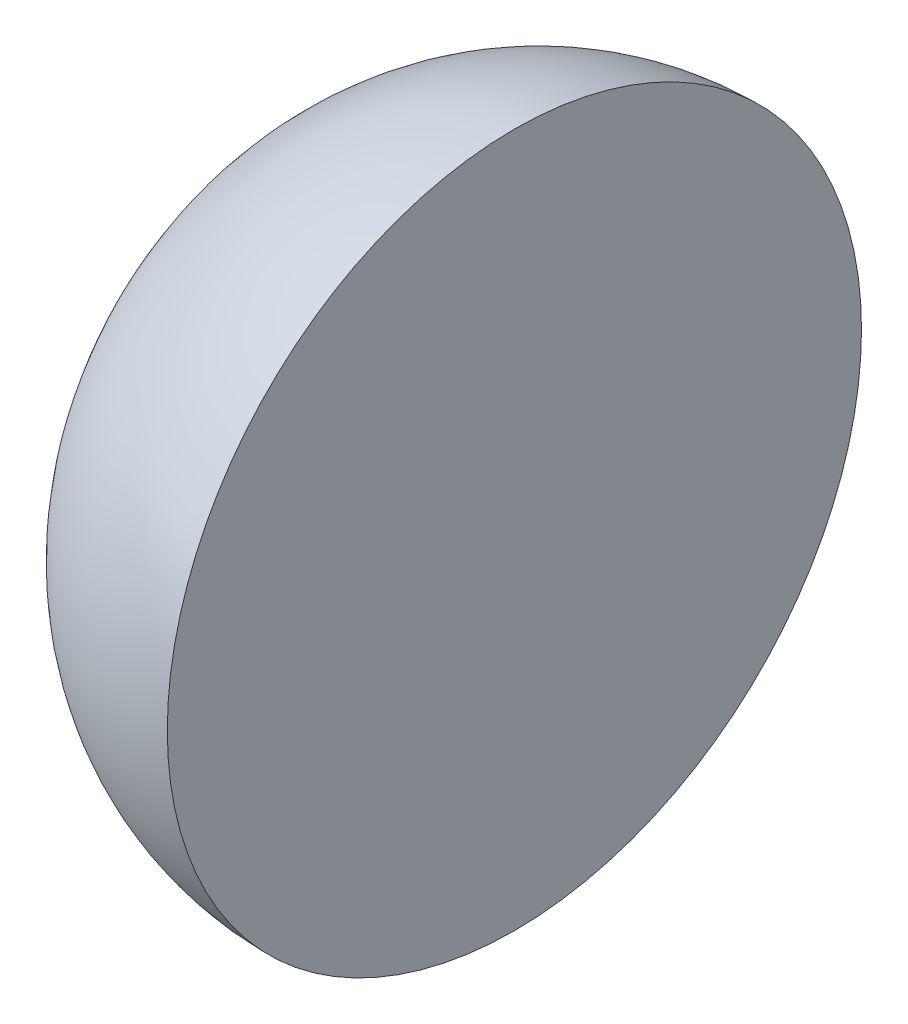
ISO-10303-21;
HEADER;
FILE_DESCRIPTION(('STEP AP214'),'2;1');
FILE_NAME('part.step','',(''),(''),'','','');
FILE_SCHEMA(('AUTOMOTIVE_DESIGN { 1 0 10303 214 1 1 1 1 }'));
ENDSEC;
DATA;
#1=APPLICATION_CONTEXT('core data for automotive mechanical design processes');
#2=APPLICATION_PROTOCOL_DEFINITION('international standard','automotive_design',2000,#1);
#3=PRODUCT_CONTEXT('',#1,'mechanical');
#4=PRODUCT('Part','Part','',(#3));
#5=PRODUCT_RELATED_PRODUCT_CATEGORY('part','',(#4));
#6=PRODUCT_DEFINITION_FORMATION('','',#4);
#7=PRODUCT_DEFINITION_CONTEXT('part definition',#1,'design');
#8=PRODUCT_DEFINITION('design','',#6,#7);
#9=PRODUCT_DEFINITION_SHAPE('','',#8);
#10=(LENGTH_UNIT() NAMED_UNIT(*) SI_UNIT(.MILLI.,.METRE.));
#11=(NAMED_UNIT(*) PLANE_ANGLE_UNIT() SI_UNIT($,.RADIAN.));
#12=(NAMED_UNIT(*) SI_UNIT($,.STERADIAN.) SOLID_ANGLE_UNIT());
#13=UNCERTAINTY_MEASURE_WITH_UNIT(LENGTH_MEASURE(1.E-05),#10,'distance_accuracy_value','');
#14=(GEOMETRIC_REPRESENTATION_CONTEXT(3) GLOBAL_UNCERTAINTY_ASSIGNED_CONTEXT((#13)) GLOBAL_UNIT_ASSIGNED_CONTEXT((#10,
#11,#12)) REPRESENTATION_CONTEXT('',''));
#15=CARTESIAN_POINT('',(0.,0.,0.));
#16=DIRECTION('',(0.,0.,1.));
#17=DIRECTION('',(1.,0.,0.));
#18=AXIS2_PLACEMENT_3D('',#15,#16,#17);
#19=CARTESIAN_POINT('',(-20.75,9.75,2.75));
#20=DIRECTION('',(1.,0.,0.));
#21=DIRECTION('',(0.,0.,-1.));
#22=AXIS2_PLACEMENT_3D('',#19,#20,#21);
#23=PLANE('',#22);
#24=DIRECTION('',(0.,1.,0.));
#25=VECTOR('',#24,1.);
#26=CARTESIAN_POINT('',(-20.75,10.125,2.375));
#27=LINE('',#26,#25);
#28=CARTESIAN_POINT('',(-20.75,11.125,2.375));
#29=VERTEX_POINT('',#28);
#30=CARTESIAN_POINT('',(-20.75,10.125,2.375));
#31=VERTEX_POINT('',#30);
#32=EDGE_CURVE('E122',#29,#31,#27,.F.);
#33=ORIENTED_EDGE('',*,*,#32,.T.);
#34=DIRECTION('',(0.,0.,1.));
#35=VECTOR('',#34,1.);
#36=CARTESIAN_POINT('',(-20.75,10.125,1.375));
#37=LINE('',#36,#35);
#38=CARTESIAN_POINT('',(-20.75,10.125,1.375));
#39=VERTEX_POINT('',#38);
#40=EDGE_CURVE('E83',#31,#39,#37,.F.);
#41=ORIENTED_EDGE('',*,*,#40,.T.);
#42=DIRECTION('',(0.,1.,0.));
#43=VECTOR('',#42,1.);
#44=CARTESIAN_POINT('',(-20.75,9.37499999999999,1.375));
#45=LINE('',#44,#43);
#46=CARTESIAN_POINT('',(-20.75,9.37499999999999,1.375));
#47=VERTEX_POINT('',#46);
#48=EDGE_CURVE('E120',#39,#47,#45,.F.);
#49=ORIENTED_EDGE('',*,*,#48,.T.);
#50=DIRECTION('',(0.,0.,-1.));
#51=VECTOR('',#50,1.);
#52=CARTESIAN_POINT('',(-20.75,9.37499999999999,2.375));
#53=LINE('',#52,#51);
#54=CARTESIAN_POINT('',(-20.75,9.37499999999999,2.375));
#55=VERTEX_POINT('',#54);
#56=EDGE_CURVE('E184',#47,#55,#53,.F.);
#57=ORIENTED_EDGE('',*,*,#56,.T.);
#58=DIRECTION('',(0.,1.,0.));
#59=VECTOR('',#58,1.);
#60=CARTESIAN_POINT('',(-20.75,8.37499999999999,2.375));
#61=LINE('',#60,#59);
#62=CARTESIAN_POINT('',(-20.75,8.37499999999999,2.375));
#63=VERTEX_POINT('',#62);
#64=EDGE_CURVE('E179',#55,#63,#61,.F.);
#65=ORIENTED_EDGE('',*,*,#64,.T.);
#66=DIRECTION('',(0.,0.,-1.));
#67=VECTOR('',#66,1.);
#68=CARTESIAN_POINT('',(-20.75,8.37499999999999,3.125));
#69=LINE('',#68,#67);
#70=CARTESIAN_POINT('',(-20.75,8.37499999999999,3.125));
#71=VERTEX_POINT('',#70);
#72=EDGE_CURVE('E174',#63,#71,#69,.F.);
#73=ORIENTED_EDGE('',*,*,#72,.T.);
#74=DIRECTION('',(0.,1.,0.));
#75=VECTOR('',#74,1.);
#76=CARTESIAN_POINT('',(-20.75,9.37499999999999,3.125));
#77=LINE('',#76,#75);
#78=CARTESIAN_POINT('',(-20.75,9.37499999999999,3.125));
#79=VERTEX_POINT('',#78);
#80=EDGE_CURVE('E169',#71,#79,#77,.T.);
#81=ORIENTED_EDGE('',*,*,#80,.T.);
#82=DIRECTION('',(0.,0.,-1.));
#83=VECTOR('',#82,1.);
#84=CARTESIAN_POINT('',(-20.75,9.37499999999999,4.125));
#85=LINE('',#84,#83);
#86=CARTESIAN_POINT('',(-20.75,9.37499999999999,4.125));
#87=VERTEX_POINT('',#86);
#88=EDGE_CURVE('E164',#79,#87,#85,.F.);
#89=ORIENTED_EDGE('',*,*,#88,.T.);
#90=DIRECTION('',(0.,1.,0.));
#91=VECTOR('',#90,1.);
#92=CARTESIAN_POINT('',(-20.75,10.125,4.125));
#93=LINE('',#92,#91);
#94=CARTESIAN_POINT('',(-20.75,10.125,4.125));
#95=VERTEX_POINT('',#94);
#96=EDGE_CURVE('E159',#87,#95,#93,.T.);
#97=ORIENTED_EDGE('',*,*,#96,.T.);
#98=DIRECTION('',(0.,0.,1.));
#99=VECTOR('',#98,1.);
#100=CARTESIAN_POINT('',(-20.75,10.125,3.125));
#101=LINE('',#100,#99);
#102=CARTESIAN_POINT('',(-20.75,10.125,3.125));
#103=VERTEX_POINT('',#102);
#104=EDGE_CURVE('E154',#95,#103,#101,.F.);
#105=ORIENTED_EDGE('',*,*,#104,.T.);
#106=DIRECTION('',(0.,1.,0.));
#107=VECTOR('',#106,1.);
#108=CARTESIAN_POINT('',(-20.75,11.125,3.125));
#109=LINE('',#108,#107);
#110=CARTESIAN_POINT('',(-20.75,11.125,3.125));
#111=VERTEX_POINT('',#110);
#112=EDGE_CURVE('E149',#103,#111,#109,.T.);
#113=ORIENTED_EDGE('',*,*,#112,.T.);
#114=DIRECTION('',(0.,0.,1.));
#115=VECTOR('',#114,1.);
#116=CARTESIAN_POINT('',(-20.75,11.125,2.375));
#117=LINE('',#116,#115);
#118=EDGE_CURVE('E92',#111,#29,#117,.F.);
#119=ORIENTED_EDGE('',*,*,#118,.T.);
#120=EDGE_LOOP('',(#33,#41,#49,#57,#65,#73,#81,#89,#97,#105,#113,#119));
#121=FACE_BOUND('',#120,.T.);
#122=ADVANCED_FACE('F17',(#121),#23,.F.);
#123=CARTESIAN_POINT('',(-21.25,10.125,1.375));
#124=DIRECTION('',(0.,1.,0.));
#125=DIRECTION('',(0.,0.,1.));
#126=AXIS2_PLACEMENT_3D('',#123,#124,#125);
#127=PLANE('',#126);
#128=DIRECTION('',(1.,0.,0.));
#129=VECTOR('',#128,1.);
#130=CARTESIAN_POINT('',(-21.25,10.125,1.375));
#131=LINE('',#130,#129);
#132=CARTESIAN_POINT('',(-20.95206917046,10.125,1.375));
#133=VERTEX_POINT('',#132);
#134=EDGE_CURVE('E123',#133,#39,#131,.T.);
#135=ORIENTED_EDGE('',*,*,#134,.T.);
#136=ORIENTED_EDGE('',*,*,#40,.F.);
#137=DIRECTION('',(-1.,0.,0.));
#138=VECTOR('',#137,1.);
#139=CARTESIAN_POINT('',(-21.25,10.125,2.375));
#140=LINE('',#139,#138);
#141=CARTESIAN_POINT('',(-21.2439590177377,10.125,2.375));
#142=VERTEX_POINT('',#141);
#143=EDGE_CURVE('E142',#31,#142,#140,.T.);
#144=ORIENTED_EDGE('',*,*,#143,.T.);
#145=CARTESIAN_POINT('',(-21.2439590177377,10.125,2.375));
#146=CARTESIAN_POINT('',(-21.2415241678344,10.125,2.33012922498625));
#147=CARTESIAN_POINT('',(-21.2380317099468,10.125,2.28529977555112));
#148=CARTESIAN_POINT('',(-21.22866149776,10.125,2.19586774018443));
#149=CARTESIAN_POINT('',(-21.2227823943305,10.125,2.15126529703897));
#150=CARTESIAN_POINT('',(-21.2084810419962,10.125,2.06316083448012));
#151=CARTESIAN_POINT('',(-21.2000990166785,10.125,2.01965241349712));
#152=CARTESIAN_POINT('',(-21.180680193298,10.125,1.93325009736368));
#153=CARTESIAN_POINT('',(-21.1696439692847,10.125,1.8903560714546));
#154=CARTESIAN_POINT('',(-21.1333281844842,10.125,1.76577788050748));
#155=CARTESIAN_POINT('',(-21.1043479651248,10.125,1.68512063273293));
#156=CARTESIAN_POINT('',(-21.0532122510357,10.125,1.56682297657241));
#157=CARTESIAN_POINT('',(-21.0347200193567,10.125,1.52755248865962));
#158=CARTESIAN_POINT('',(-20.9952471992651,10.125,1.45028612113653));
#159=CARTESIAN_POINT('',(-20.9742667750345,10.125,1.41229015763946));
#160=CARTESIAN_POINT('',(-20.95206917046,10.125,1.37499999999999));
#161=B_SPLINE_CURVE_WITH_KNOTS('',3,(#145,#146,#147,#148,#149,#150,#151,#152,#153,#154,#155,
#156,#157,#158,#159,#160),.UNSPECIFIED.,.F.,.F.,(4,2,2,2,2,2,2,4),(0.,0.134821808531533,
0.269719935908995,0.402557232082309,0.535365824032561,0.791695165178939,0.921840070719895,
1.05197639349783),.UNSPECIFIED.);
#162=EDGE_CURVE('E22',#142,#133,#161,.T.);
#163=ORIENTED_EDGE('',*,*,#162,.T.);
#164=EDGE_LOOP('',(#135,#136,#144,#163));
#165=FACE_BOUND('',#164,.T.);
#166=ADVANCED_FACE('F131',(#165),#127,.F.);
#167=CARTESIAN_POINT('',(-19.25,9.74999999999999,2.75));
#168=DIRECTION('',(-1.,0.,0.));
#169=DIRECTION('',(0.,0.,1.));
#170=AXIS2_PLACEMENT_3D('',#167,#168,#169);
#171=PLANE('',#170);
#172=CARTESIAN_POINT('',(-19.25,9.75,2.75));
#173=DIRECTION('',(-1.,0.,0.));
#174=DIRECTION('',(0.,0.,1.));
#175=AXIS2_PLACEMENT_3D('',#172,#173,#174);
#176=CIRCLE('',#175,2.37500000000002);
#177=CARTESIAN_POINT('',(-19.25,9.75,5.12500000000002));
#178=VERTEX_POINT('',#177);
#179=EDGE_CURVE('E297',#178,#178,#176,.F.);
#180=ORIENTED_EDGE('',*,*,#179,.T.);
#181=EDGE_LOOP('',(#180));
#182=FACE_BOUND('',#181,.T.);
#183=ADVANCED_FACE('F292',(#182),#171,.F.);
#184=CARTESIAN_POINT('',(-21.25,9.37499999999999,1.375));
#185=DIRECTION('',(0.,0.,-1.));
#186=DIRECTION('',(0.,1.,0.));
#187=AXIS2_PLACEMENT_3D('',#184,#185,#186);
#188=PLANE('',#187);
#189=DIRECTION('',(1.,0.,0.));
#190=VECTOR('',#189,1.);
#191=CARTESIAN_POINT('',(-21.25,9.37499999999999,1.375));
#192=LINE('',#191,#190);
#193=CARTESIAN_POINT('',(-20.95206917046,9.37499999999999,1.37499999999999));
#194=VERTEX_POINT('',#193);
#195=EDGE_CURVE('E129',#194,#47,#192,.T.);
#196=ORIENTED_EDGE('',*,*,#195,.T.);
#197=ORIENTED_EDGE('',*,*,#48,.F.);
#198=ORIENTED_EDGE('',*,*,#134,.F.);
#199=CARTESIAN_POINT('',(-20.95206917046,10.125,1.375));
#200=CARTESIAN_POINT('',(-20.9621456179055,10.0628385953311,1.375));
#201=CARTESIAN_POINT('',(-20.9696566857235,10.0002733297851,1.375));
#202=CARTESIAN_POINT('',(-20.979593355914,9.87513701815892,1.375));
#203=CARTESIAN_POINT('',(-20.9820508075689,9.81256850907946,1.375));
#204=CARTESIAN_POINT('',(-20.9820508075689,9.68743149092055,1.375));
#205=CARTESIAN_POINT('',(-20.979593355914,9.62486298184109,1.375));
#206=CARTESIAN_POINT('',(-20.9696566857235,9.49972667021488,1.375));
#207=CARTESIAN_POINT('',(-20.9621456179055,9.43716140466888,1.375));
#208=CARTESIAN_POINT('',(-20.95206917046,9.37499999999999,1.375));
#209=B_SPLINE_CURVE_WITH_KNOTS('',3,(#199,#200,#201,#202,#203,#204,#205,#206,#207,#208),
.UNSPECIFIED.,.F.,.F.,(4,2,2,2,4),(0.,0.188846993863293,0.376500128444398,0.56415326302551,
0.753000256888811),.UNSPECIFIED.);
#210=EDGE_CURVE('E293',#133,#194,#209,.T.);
#211=ORIENTED_EDGE('',*,*,#210,.T.);
#212=EDGE_LOOP('',(#196,#197,#198,#211));
#213=FACE_BOUND('',#212,.T.);
#214=ADVANCED_FACE('F127',(#213),#188,.F.);
#215=CARTESIAN_POINT('',(-21.25,9.37499999999999,2.375));
#216=DIRECTION('',(0.,-1.,0.));
#217=DIRECTION('',(0.,0.,-1.));
#218=AXIS2_PLACEMENT_3D('',#215,#216,#217);
#219=PLANE('',#218);
#220=DIRECTION('',(-1.,0.,0.));
#221=VECTOR('',#220,1.);
#222=CARTESIAN_POINT('',(-21.25,9.37499999999999,2.375));
#223=LINE('',#222,#221);
#224=CARTESIAN_POINT('',(-21.2439590177377,9.37499999999999,2.375));
#225=VERTEX_POINT('',#224);
#226=EDGE_CURVE('E181',#225,#55,#223,.F.);
#227=ORIENTED_EDGE('',*,*,#226,.T.);
#228=ORIENTED_EDGE('',*,*,#56,.F.);
#229=ORIENTED_EDGE('',*,*,#195,.F.);
#230=CARTESIAN_POINT('',(-20.95206917046,9.37499999999999,1.37499999999999));
#231=CARTESIAN_POINT('',(-20.9815202238228,9.37499999999999,1.42445394584342));
#232=CARTESIAN_POINT('',(-21.0088247416915,9.37499999999999,1.47517922940138));
#233=CARTESIAN_POINT('',(-21.059015577092,9.37499999999999,1.57876262696262));
#234=CARTESIAN_POINT('',(-21.0819025176563,9.37499999999999,1.63162043893184));
#235=CARTESIAN_POINT('',(-21.1227570000683,9.37499999999999,1.73807150409609));
#236=CARTESIAN_POINT('',(-21.140808307968,9.37499999999999,1.79163266958474));
#237=CARTESIAN_POINT('',(-21.1725153674276,9.37499999999999,1.90001808591783));
#238=CARTESIAN_POINT('',(-21.1861724145737,9.37499999999999,1.95484195935276));
#239=CARTESIAN_POINT('',(-21.2101130034466,9.37499999999999,2.06988220117697));
#240=CARTESIAN_POINT('',(-21.220031982235,9.37499999999999,2.13017459290633));
#241=CARTESIAN_POINT('',(-21.2314568627984,9.37499999999999,2.22134058616975));
#242=CARTESIAN_POINT('',(-21.2346972062246,9.37499999999999,2.25201123846284));
#243=CARTESIAN_POINT('',(-21.2401042825536,9.37499999999999,2.31344606312108));
#244=CARTESIAN_POINT('',(-21.2422710733006,9.37499999999999,2.34421023035766));
#245=CARTESIAN_POINT('',(-21.2439590177377,9.37499999999999,2.375));
#246=B_SPLINE_CURVE_WITH_KNOTS('',3,(#230,#231,#232,#233,#234,#235,#236,#237,#238,#239,#240,
#241,#242,#243,#244,#245),.UNSPECIFIED.,.F.,.F.,(4,2,2,2,2,2,2,4),(0.,0.172615608508582,
0.345206854380578,0.514580128497442,0.683903419425338,0.866993544415386,0.959501821995569,
1.05200511459387),.UNSPECIFIED.);
#247=EDGE_CURVE('E274',#194,#225,#246,.T.);
#248=ORIENTED_EDGE('',*,*,#247,.T.);
#249=EDGE_LOOP('',(#227,#228,#229,#248));
#250=FACE_BOUND('',#249,.T.);
#251=ADVANCED_FACE('F283',(#250),#219,.F.);
#252=CARTESIAN_POINT('',(-21.25,8.37499999999999,2.375));
#253=DIRECTION('',(0.,0.,-1.));
#254=DIRECTION('',(-1.,0.,0.));
#255=AXIS2_PLACEMENT_3D('',#252,#253,#254);
#256=PLANE('',#255);
#257=DIRECTION('',(1.,0.,0.));
#258=VECTOR('',#257,1.);
#259=CARTESIAN_POINT('',(-21.25,8.37499999999999,2.375));
#260=LINE('',#259,#258);
#261=CARTESIAN_POINT('',(-20.95206917046,8.37499999999999,2.375));
#262=VERTEX_POINT('',#261);
#263=EDGE_CURVE('E176',#262,#63,#260,.T.);
#264=ORIENTED_EDGE('',*,*,#263,.T.);
#265=ORIENTED_EDGE('',*,*,#64,.F.);
#266=ORIENTED_EDGE('',*,*,#226,.F.);
#267=CARTESIAN_POINT('',(-21.2439590177377,9.37499999999999,2.375));
#268=CARTESIAN_POINT('',(-21.2415241678344,9.33012922498624,2.375));
#269=CARTESIAN_POINT('',(-21.2380317099468,9.28529977555111,2.375));
#270=CARTESIAN_POINT('',(-21.22866149776,9.19586774018441,2.375));
#271=CARTESIAN_POINT('',(-21.2227823943305,9.15126529703895,2.375));
#272=CARTESIAN_POINT('',(-21.2084810419962,9.0631608344801,2.375));
#273=CARTESIAN_POINT('',(-21.2000990166785,9.0196524134971,2.375));
#274=CARTESIAN_POINT('',(-21.180680193298,8.93325009736366,2.375));
#275=CARTESIAN_POINT('',(-21.1696439692847,8.89035607145458,2.375));
#276=CARTESIAN_POINT('',(-21.1333281844842,8.76577788050746,2.375));
#277=CARTESIAN_POINT('',(-21.1043479651248,8.68512063273291,2.375));
#278=CARTESIAN_POINT('',(-21.0532122510357,8.56682297657239,2.375));
#279=CARTESIAN_POINT('',(-21.0347200193567,8.52755248865961,2.375));
#280=CARTESIAN_POINT('',(-20.9952471992651,8.45028612113651,2.375));
#281=CARTESIAN_POINT('',(-20.9742667750345,8.41229015763945,2.375));
#282=CARTESIAN_POINT('',(-20.95206917046,8.37499999999998,2.375));
#283=B_SPLINE_CURVE_WITH_KNOTS('',3,(#267,#268,#269,#270,#271,#272,#273,#274,#275,#276,#277,
#278,#279,#280,#281,#282),.UNSPECIFIED.,.F.,.F.,(4,2,2,2,2,2,2,4),(0.,0.134821808531537,
0.269719935909001,0.402557232082319,0.535365824032574,0.79169516517895,0.921840070719903,
1.05197639349784),.UNSPECIFIED.);
#284=EDGE_CURVE('E268',#225,#262,#283,.T.);
#285=ORIENTED_EDGE('',*,*,#284,.T.);
#286=EDGE_LOOP('',(#264,#265,#266,#285));
#287=FACE_BOUND('',#286,.T.);
#288=ADVANCED_FACE('F280',(#287),#256,.F.);
#289=CARTESIAN_POINT('',(-21.25,8.37499999999999,3.125));
#290=DIRECTION('',(0.,-1.,0.));
#291=DIRECTION('',(0.,0.,-1.));
#292=AXIS2_PLACEMENT_3D('',#289,#290,#291);
#293=PLANE('',#292);
#294=DIRECTION('',(1.,0.,0.));
#295=VECTOR('',#294,1.);
#296=CARTESIAN_POINT('',(-21.25,8.37499999999999,3.125));
#297=LINE('',#296,#295);
#298=CARTESIAN_POINT('',(-20.95206917046,8.37499999999998,3.125));
#299=VERTEX_POINT('',#298);
#300=EDGE_CURVE('E171',#299,#71,#297,.T.);
#301=ORIENTED_EDGE('',*,*,#300,.T.);
#302=ORIENTED_EDGE('',*,*,#72,.F.);
#303=ORIENTED_EDGE('',*,*,#263,.F.);
#304=CARTESIAN_POINT('',(-20.95206917046,8.37499999999999,2.375));
#305=CARTESIAN_POINT('',(-20.9621456176892,8.37499999999999,2.43716140467878));
#306=CARTESIAN_POINT('',(-20.9696566855895,8.37499999999999,2.49972667023044));
#307=CARTESIAN_POINT('',(-20.9795933560495,8.37499999999999,2.62486298185525));
#308=CARTESIAN_POINT('',(-20.9820508078917,8.37499999999999,2.68743149092762));
#309=CARTESIAN_POINT('',(-20.9820508078917,8.37499999999999,2.81256850907237));
#310=CARTESIAN_POINT('',(-20.9795933560495,8.37499999999999,2.87513701814475));
#311=CARTESIAN_POINT('',(-20.9696566855895,8.37499999999999,3.00027332976956));
#312=CARTESIAN_POINT('',(-20.9621456176892,8.37499999999999,3.06283859532122));
#313=CARTESIAN_POINT('',(-20.95206917046,8.37499999999999,3.125));
#314=B_SPLINE_CURVE_WITH_KNOTS('',3,(#304,#305,#306,#307,#308,#309,#310,#311,#312,#313),
.UNSPECIFIED.,.F.,.F.,(4,2,2,2,4),(0.,0.188846993882428,0.376500128457145,0.564153263031861,
0.753000256914289),.UNSPECIFIED.);
#315=EDGE_CURVE('E262',#262,#299,#314,.T.);
#316=ORIENTED_EDGE('',*,*,#315,.T.);
#317=EDGE_LOOP('',(#301,#302,#303,#316));
#318=FACE_BOUND('',#317,.T.);
#319=ADVANCED_FACE('F252',(#318),#293,.F.);
#320=CARTESIAN_POINT('',(-21.25,9.37499999999999,3.125));
#321=DIRECTION('',(0.,0.,1.));
#322=DIRECTION('',(1.,0.,0.));
#323=AXIS2_PLACEMENT_3D('',#320,#321,#322);
#324=PLANE('',#323);
#325=DIRECTION('',(1.,0.,0.));
#326=VECTOR('',#325,1.);
#327=CARTESIAN_POINT('',(-21.25,9.37499999999999,3.125));
#328=LINE('',#327,#326);
#329=CARTESIAN_POINT('',(-21.2439590177377,9.37499999999999,3.125));
#330=VERTEX_POINT('',#329);
#331=EDGE_CURVE('E166',#330,#79,#328,.T.);
#332=ORIENTED_EDGE('',*,*,#331,.T.);
#333=ORIENTED_EDGE('',*,*,#80,.F.);
#334=ORIENTED_EDGE('',*,*,#300,.F.);
#335=CARTESIAN_POINT('',(-20.95206917046,8.37499999999998,3.125));
#336=CARTESIAN_POINT('',(-20.9815202238228,8.42445394584341,3.125));
#337=CARTESIAN_POINT('',(-21.0088247416915,8.47517922940137,3.125));
#338=CARTESIAN_POINT('',(-21.059015577092,8.57876262696261,3.125));
#339=CARTESIAN_POINT('',(-21.0819025176563,8.63162043893183,3.125));
#340=CARTESIAN_POINT('',(-21.1227570000683,8.73807150409607,3.125));
#341=CARTESIAN_POINT('',(-21.140808307968,8.79163266958473,3.125));
#342=CARTESIAN_POINT('',(-21.1725153674276,8.90001808591782,3.125));
#343=CARTESIAN_POINT('',(-21.1861724145737,8.95484195935275,3.125));
#344=CARTESIAN_POINT('',(-21.2101130034466,9.06988220117696,3.125));
#345=CARTESIAN_POINT('',(-21.220031982235,9.13017459290633,3.125));
#346=CARTESIAN_POINT('',(-21.2314568627984,9.22134058616975,3.125));
#347=CARTESIAN_POINT('',(-21.2346972062246,9.25201123846283,3.125));
#348=CARTESIAN_POINT('',(-21.2401042825536,9.31344606312107,3.125));
#349=CARTESIAN_POINT('',(-21.2422710733006,9.34421023035765,3.125));
#350=CARTESIAN_POINT('',(-21.2439590177377,9.37499999999999,3.125));
#351=B_SPLINE_CURVE_WITH_KNOTS('',3,(#335,#336,#337,#338,#339,#340,#341,#342,#343,#344,#345,
#346,#347,#348,#349,#350),.UNSPECIFIED.,.F.,.F.,(4,2,2,2,2,2,2,4),(0.,0.172615608508583,
0.345206854380576,0.514580128497441,0.683903419425338,0.866993544415387,0.959501821995568,
1.05200511459387),.UNSPECIFIED.);
#352=EDGE_CURVE('E256',#299,#330,#351,.T.);
#353=ORIENTED_EDGE('',*,*,#352,.T.);
#354=EDGE_LOOP('',(#332,#333,#334,#353));
#355=FACE_BOUND('',#354,.T.);
#356=ADVANCED_FACE('F247',(#355),#324,.F.);
#357=CARTESIAN_POINT('',(-21.25,9.37499999999999,4.125));
#358=DIRECTION('',(0.,-1.,0.));
#359=DIRECTION('',(0.,0.,-1.));
#360=AXIS2_PLACEMENT_3D('',#357,#358,#359);
#361=PLANE('',#360);
#362=DIRECTION('',(1.,0.,0.));
#363=VECTOR('',#362,1.);
#364=CARTESIAN_POINT('',(-21.25,9.37499999999999,4.125));
#365=LINE('',#364,#363);
#366=CARTESIAN_POINT('',(-20.95206917046,9.37499999999999,4.125));
#367=VERTEX_POINT('',#366);
#368=EDGE_CURVE('E161',#367,#87,#365,.T.);
#369=ORIENTED_EDGE('',*,*,#368,.T.);
#370=ORIENTED_EDGE('',*,*,#88,.F.);
#371=ORIENTED_EDGE('',*,*,#331,.F.);
#372=CARTESIAN_POINT('',(-21.2439590177377,9.37499999999999,3.125));
#373=CARTESIAN_POINT('',(-21.2415241678344,9.37499999999999,3.16987077501375));
#374=CARTESIAN_POINT('',(-21.2380317099468,9.37499999999999,3.21470022444888));
#375=CARTESIAN_POINT('',(-21.22866149776,9.37499999999999,3.30413225981558));
#376=CARTESIAN_POINT('',(-21.2227823943305,9.37499999999999,3.34873470296104));
#377=CARTESIAN_POINT('',(-21.2084810419962,9.37499999999999,3.43683916551989));
#378=CARTESIAN_POINT('',(-21.2000990166785,9.37499999999999,3.48034758650289));
#379=CARTESIAN_POINT('',(-21.180680193298,9.37499999999999,3.56674990263633));
#380=CARTESIAN_POINT('',(-21.1696439692847,9.37499999999999,3.60964392854541));
#381=CARTESIAN_POINT('',(-21.1333281844842,9.37499999999999,3.73422211949253));
#382=CARTESIAN_POINT('',(-21.1043479651248,9.37499999999999,3.81487936726707));
#383=CARTESIAN_POINT('',(-21.0532122510357,9.37499999999999,3.9331770234276));
#384=CARTESIAN_POINT('',(-21.0347200193567,9.37499999999999,3.97244751134038));
#385=CARTESIAN_POINT('',(-20.9952471992651,9.37499999999999,4.04971387886347));
#386=CARTESIAN_POINT('',(-20.9742667750345,9.37499999999999,4.08770984236054));
#387=CARTESIAN_POINT('',(-20.95206917046,9.37499999999999,4.12500000000001));
#388=B_SPLINE_CURVE_WITH_KNOTS('',3,(#372,#373,#374,#375,#376,#377,#378,#379,#380,#381,#382,
#383,#384,#385,#386,#387),.UNSPECIFIED.,.F.,.F.,(4,2,2,2,2,2,2,4),(0.,0.134821808531535,
0.269719935909,0.402557232082316,0.53536582403257,0.791695165178944,0.921840070719897,
1.05197639349783),.UNSPECIFIED.);
#389=EDGE_CURVE('E233',#330,#367,#388,.T.);
#390=ORIENTED_EDGE('',*,*,#389,.T.);
#391=EDGE_LOOP('',(#369,#370,#371,#390));
#392=FACE_BOUND('',#391,.T.);
#393=ADVANCED_FACE('F242',(#392),#361,.F.);
#394=CARTESIAN_POINT('',(-21.25,10.125,4.125));
#395=DIRECTION('',(0.,0.,1.));
#396=DIRECTION('',(1.,0.,0.));
#397=AXIS2_PLACEMENT_3D('',#394,#395,#396);
#398=PLANE('',#397);
#399=DIRECTION('',(1.,0.,0.));
#400=VECTOR('',#399,1.);
#401=CARTESIAN_POINT('',(-21.25,10.125,4.125));
#402=LINE('',#401,#400);
#403=CARTESIAN_POINT('',(-20.95206917046,10.125,4.12500000000001));
#404=VERTEX_POINT('',#403);
#405=EDGE_CURVE('E156',#404,#95,#402,.T.);
#406=ORIENTED_EDGE('',*,*,#405,.T.);
#407=ORIENTED_EDGE('',*,*,#96,.F.);
#408=ORIENTED_EDGE('',*,*,#368,.F.);
#409=CARTESIAN_POINT('',(-20.95206917046,9.37499999999999,4.125));
#410=CARTESIAN_POINT('',(-20.9621456176893,9.43716140467877,4.125));
#411=CARTESIAN_POINT('',(-20.9696566855895,9.49972667023043,4.125));
#412=CARTESIAN_POINT('',(-20.9795933560495,9.62486298185524,4.125));
#413=CARTESIAN_POINT('',(-20.9820508078917,9.68743149092762,4.125));
#414=CARTESIAN_POINT('',(-20.9820508078917,9.81256850907237,4.125));
#415=CARTESIAN_POINT('',(-20.9795933560495,9.87513701814475,4.125));
#416=CARTESIAN_POINT('',(-20.9696566855895,10.0002733297696,4.125));
#417=CARTESIAN_POINT('',(-20.9621456176893,10.0628385953212,4.125));
#418=CARTESIAN_POINT('',(-20.95206917046,10.125,4.125));
#419=B_SPLINE_CURVE_WITH_KNOTS('',3,(#409,#410,#411,#412,#413,#414,#415,#416,#417,#418),
.UNSPECIFIED.,.F.,.F.,(4,2,2,2,4),(0.,0.188846993882431,0.376500128457149,0.564153263031867,
0.753000256914298),.UNSPECIFIED.);
#420=EDGE_CURVE('E227',#367,#404,#419,.T.);
#421=ORIENTED_EDGE('',*,*,#420,.T.);
#422=EDGE_LOOP('',(#406,#407,#408,#421));
#423=FACE_BOUND('',#422,.T.);
#424=ADVANCED_FACE('F239',(#423),#398,.F.);
#425=CARTESIAN_POINT('',(-21.25,10.125,3.125));
#426=DIRECTION('',(0.,1.,0.));
#427=DIRECTION('',(0.,0.,1.));
#428=AXIS2_PLACEMENT_3D('',#425,#426,#427);
#429=PLANE('',#428);
#430=DIRECTION('',(1.,0.,0.));
#431=VECTOR('',#430,1.);
#432=CARTESIAN_POINT('',(-21.25,10.125,3.125));
#433=LINE('',#432,#431);
#434=CARTESIAN_POINT('',(-21.2439590177377,10.125,3.125));
#435=VERTEX_POINT('',#434);
#436=EDGE_CURVE('E151',#435,#103,#433,.T.);
#437=ORIENTED_EDGE('',*,*,#436,.T.);
#438=ORIENTED_EDGE('',*,*,#104,.F.);
#439=ORIENTED_EDGE('',*,*,#405,.F.);
#440=CARTESIAN_POINT('',(-20.95206917046,10.125,4.12500000000001));
#441=CARTESIAN_POINT('',(-20.9815202238228,10.125,4.07554605415658));
#442=CARTESIAN_POINT('',(-21.0088247416915,10.125,4.02482077059862));
#443=CARTESIAN_POINT('',(-21.059015577092,10.125,3.92123737303738));
#444=CARTESIAN_POINT('',(-21.0819025176563,10.125,3.86837956106816));
#445=CARTESIAN_POINT('',(-21.1227570000683,10.125,3.76192849590391));
#446=CARTESIAN_POINT('',(-21.140808307968,10.125,3.70836733041525));
#447=CARTESIAN_POINT('',(-21.1725153674276,10.125,3.59998191408217));
#448=CARTESIAN_POINT('',(-21.1861724145737,10.125,3.54515804064724));
#449=CARTESIAN_POINT('',(-21.2101130034466,10.125,3.43011779882303));
#450=CARTESIAN_POINT('',(-21.220031982235,10.125,3.36982540709366));
#451=CARTESIAN_POINT('',(-21.2314568627984,10.125,3.27865941383025));
#452=CARTESIAN_POINT('',(-21.2346972062246,10.125,3.24798876153715));
#453=CARTESIAN_POINT('',(-21.2401042825536,10.125,3.18655393687892));
#454=CARTESIAN_POINT('',(-21.2422710733006,10.125,3.15578976964234));
#455=CARTESIAN_POINT('',(-21.2439590177377,10.125,3.125));
#456=B_SPLINE_CURVE_WITH_KNOTS('',3,(#440,#441,#442,#443,#444,#445,#446,#447,#448,#449,#450,
#451,#452,#453,#454,#455),.UNSPECIFIED.,.F.,.F.,(4,2,2,2,2,2,2,4),(0.,0.172615608508583,
0.345206854380579,0.514580128497443,0.683903419425341,0.866993544415387,0.959501821995568,
1.05200511459387),.UNSPECIFIED.);
#457=EDGE_CURVE('E221',#404,#435,#456,.T.);
#458=ORIENTED_EDGE('',*,*,#457,.T.);
#459=EDGE_LOOP('',(#437,#438,#439,#458));
#460=FACE_BOUND('',#459,.T.);
#461=ADVANCED_FACE('F211',(#460),#429,.F.);
#462=CARTESIAN_POINT('',(-21.25,11.125,3.125));
#463=DIRECTION('',(0.,0.,1.));
#464=DIRECTION('',(1.,0.,0.));
#465=AXIS2_PLACEMENT_3D('',#462,#463,#464);
#466=PLANE('',#465);
#467=DIRECTION('',(1.,0.,0.));
#468=VECTOR('',#467,1.);
#469=CARTESIAN_POINT('',(-21.25,11.125,3.125));
#470=LINE('',#469,#468);
#471=CARTESIAN_POINT('',(-20.95206917046,11.125,3.125));
#472=VERTEX_POINT('',#471);
#473=EDGE_CURVE('E146',#472,#111,#470,.T.);
#474=ORIENTED_EDGE('',*,*,#473,.T.);
#475=ORIENTED_EDGE('',*,*,#112,.F.);
#476=ORIENTED_EDGE('',*,*,#436,.F.);
#477=CARTESIAN_POINT('',(-21.2439590177377,10.125,3.125));
#478=CARTESIAN_POINT('',(-21.2415241678344,10.1698707750137,3.125));
#479=CARTESIAN_POINT('',(-21.2380317099468,10.2147002244489,3.125));
#480=CARTESIAN_POINT('',(-21.22866149776,10.3041322598156,3.125));
#481=CARTESIAN_POINT('',(-21.2227823943305,10.348734702961,3.125));
#482=CARTESIAN_POINT('',(-21.2084810419962,10.4368391655199,3.125));
#483=CARTESIAN_POINT('',(-21.2000990166785,10.4803475865029,3.125));
#484=CARTESIAN_POINT('',(-21.180680193298,10.5667499026363,3.125));
#485=CARTESIAN_POINT('',(-21.1696439692847,10.6096439285454,3.125));
#486=CARTESIAN_POINT('',(-21.1333281844842,10.7342221194925,3.125));
#487=CARTESIAN_POINT('',(-21.1043479651248,10.8148793672671,3.125));
#488=CARTESIAN_POINT('',(-21.0532122510357,10.9331770234276,3.125));
#489=CARTESIAN_POINT('',(-21.0347200193567,10.9724475113404,3.125));
#490=CARTESIAN_POINT('',(-20.9952471992651,11.0497138788635,3.125));
#491=CARTESIAN_POINT('',(-20.9742667750345,11.0877098423605,3.125));
#492=CARTESIAN_POINT('',(-20.95206917046,11.125,3.125));
#493=B_SPLINE_CURVE_WITH_KNOTS('',3,(#477,#478,#479,#480,#481,#482,#483,#484,#485,#486,#487,
#488,#489,#490,#491,#492),.UNSPECIFIED.,.F.,.F.,(4,2,2,2,2,2,2,4),(0.,0.134821808531532,
0.269719935908996,0.402557232082309,0.53536582403256,0.791695165178941,0.921840070719896,
1.05197639349783),.UNSPECIFIED.);
#494=EDGE_CURVE('E215',#435,#472,#493,.T.);
#495=ORIENTED_EDGE('',*,*,#494,.T.);
#496=EDGE_LOOP('',(#474,#475,#476,#495));
#497=FACE_BOUND('',#496,.T.);
#498=ADVANCED_FACE('F206',(#497),#466,.F.);
#499=CARTESIAN_POINT('',(-21.25,11.125,2.375));
#500=DIRECTION('',(0.,1.,0.));
#501=DIRECTION('',(0.,0.,1.));
#502=AXIS2_PLACEMENT_3D('',#499,#500,#501);
#503=PLANE('',#502);
#504=DIRECTION('',(-1.,0.,0.));
#505=VECTOR('',#504,1.);
#506=CARTESIAN_POINT('',(-21.25,11.125,2.375));
#507=LINE('',#506,#505);
#508=CARTESIAN_POINT('',(-20.95206917046,11.125,2.375));
#509=VERTEX_POINT('',#508);
#510=EDGE_CURVE('E40',#509,#29,#507,.F.);
#511=ORIENTED_EDGE('',*,*,#510,.T.);
#512=ORIENTED_EDGE('',*,*,#118,.F.);
#513=ORIENTED_EDGE('',*,*,#473,.F.);
#514=CARTESIAN_POINT('',(-20.95206917046,11.125,3.125));
#515=CARTESIAN_POINT('',(-20.9621456176893,11.125,3.06283859532122));
#516=CARTESIAN_POINT('',(-20.9696566855895,11.125,3.00027332976956));
#517=CARTESIAN_POINT('',(-20.9795933560495,11.125,2.87513701814475));
#518=CARTESIAN_POINT('',(-20.9820508078917,11.125,2.81256850907238));
#519=CARTESIAN_POINT('',(-20.9820508078917,11.125,2.68743149092763));
#520=CARTESIAN_POINT('',(-20.9795933560495,11.125,2.62486298185525));
#521=CARTESIAN_POINT('',(-20.9696566855895,11.125,2.49972667023044));
#522=CARTESIAN_POINT('',(-20.9621456176893,11.125,2.43716140467878));
#523=CARTESIAN_POINT('',(-20.95206917046,11.125,2.375));
#524=B_SPLINE_CURVE_WITH_KNOTS('',3,(#514,#515,#516,#517,#518,#519,#520,#521,#522,#523),
.UNSPECIFIED.,.F.,.F.,(4,2,2,2,4),(0.,0.188846993882429,0.376500128457145,0.56415326303186,
0.75300025691429),.UNSPECIFIED.);
#525=EDGE_CURVE('E32',#472,#509,#524,.T.);
#526=ORIENTED_EDGE('',*,*,#525,.T.);
#527=EDGE_LOOP('',(#511,#512,#513,#526));
#528=FACE_BOUND('',#527,.T.);
#529=ADVANCED_FACE('F202',(#528),#503,.F.);
#530=CARTESIAN_POINT('',(-21.25,10.125,2.375));
#531=DIRECTION('',(0.,0.,-1.));
#532=DIRECTION('',(-1.,0.,0.));
#533=AXIS2_PLACEMENT_3D('',#530,#531,#532);
#534=PLANE('',#533);
#535=ORIENTED_EDGE('',*,*,#143,.F.);
#536=ORIENTED_EDGE('',*,*,#32,.F.);
#537=ORIENTED_EDGE('',*,*,#510,.F.);
#538=CARTESIAN_POINT('',(-20.95206917046,11.125,2.375));
#539=CARTESIAN_POINT('',(-20.9815202238228,11.0755460541566,2.375));
#540=CARTESIAN_POINT('',(-21.0088247416915,11.0248207705986,2.375));
#541=CARTESIAN_POINT('',(-21.059015577092,10.9212373730374,2.375));
#542=CARTESIAN_POINT('',(-21.0819025176563,10.8683795610682,2.375));
#543=CARTESIAN_POINT('',(-21.1227570000683,10.7619284959039,2.375));
#544=CARTESIAN_POINT('',(-21.140808307968,10.7083673304153,2.375));
#545=CARTESIAN_POINT('',(-21.1725153674276,10.5999819140822,2.375));
#546=CARTESIAN_POINT('',(-21.1861724145737,10.5451580406472,2.375));
#547=CARTESIAN_POINT('',(-21.2101130034466,10.430117798823,2.375));
#548=CARTESIAN_POINT('',(-21.220031982235,10.3698254070937,2.375));
#549=CARTESIAN_POINT('',(-21.2314568627984,10.2786594138302,2.375));
#550=CARTESIAN_POINT('',(-21.2346972062246,10.2479887615372,2.375));
#551=CARTESIAN_POINT('',(-21.2401042825536,10.1865539368789,2.375));
#552=CARTESIAN_POINT('',(-21.2422710733006,10.1557897696423,2.375));
#553=CARTESIAN_POINT('',(-21.2439590177377,10.125,2.375));
#554=B_SPLINE_CURVE_WITH_KNOTS('',3,(#538,#539,#540,#541,#542,#543,#544,#545,#546,#547,#548,
#549,#550,#551,#552,#553),.UNSPECIFIED.,.F.,.F.,(4,2,2,2,2,2,2,4),(0.,0.172615608508586,
0.345206854380579,0.514580128497445,0.683903419425341,0.866993544415388,0.959501821995569,
1.05200511459388),.UNSPECIFIED.);
#555=EDGE_CURVE('E11',#509,#142,#554,.T.);
#556=ORIENTED_EDGE('',*,*,#555,.T.);
#557=EDGE_LOOP('',(#535,#536,#537,#556));
#558=FACE_BOUND('',#557,.T.);
#559=ADVANCED_FACE('F199',(#558),#534,.F.);
#560=CARTESIAN_POINT('',(-19.25,9.75,2.75));
#561=DIRECTION('',(-1.,0.,0.));
#562=DIRECTION('',(0.,0.,1.));
#563=AXIS2_PLACEMENT_3D('',#560,#561,#562);
#564=DEGENERATE_TOROIDAL_SURFACE('',#563,0.375000000000027,1.99999999999999,.T.);
#565=ORIENTED_EDGE('',*,*,#179,.F.);
#566=EDGE_LOOP('',(#565));
#567=FACE_BOUND('',#566,.T.);
#568=ORIENTED_EDGE('',*,*,#525,.F.);
#569=ORIENTED_EDGE('',*,*,#494,.F.);
#570=ORIENTED_EDGE('',*,*,#457,.F.);
#571=ORIENTED_EDGE('',*,*,#420,.F.);
#572=ORIENTED_EDGE('',*,*,#389,.F.);
#573=ORIENTED_EDGE('',*,*,#352,.F.);
#574=ORIENTED_EDGE('',*,*,#315,.F.);
#575=ORIENTED_EDGE('',*,*,#284,.F.);
#576=ORIENTED_EDGE('',*,*,#247,.F.);
#577=ORIENTED_EDGE('',*,*,#210,.F.);
#578=ORIENTED_EDGE('',*,*,#162,.F.);
#579=ORIENTED_EDGE('',*,*,#555,.F.);
#580=EDGE_LOOP('',(#568,#569,#570,#571,#572,#573,#574,#575,#576,#577,#578,#579));
#581=FACE_BOUND('',#580,.T.);
#582=ADVANCED_FACE('F19',(#567,#581),#564,.T.);
#583=CLOSED_SHELL('',(#122,#166,#183,#214,#251,#288,#319,#356,#393,#424,#461,#498,#529,#559,#582));
#584=MANIFOLD_SOLID_BREP('B1',#583);
#585=ADVANCED_BREP_SHAPE_REPRESENTATION('',(#18,#584),#14);
#586=SHAPE_DEFINITION_REPRESENTATION(#9,#585);
ENDSEC;
END-ISO-10303-21;
